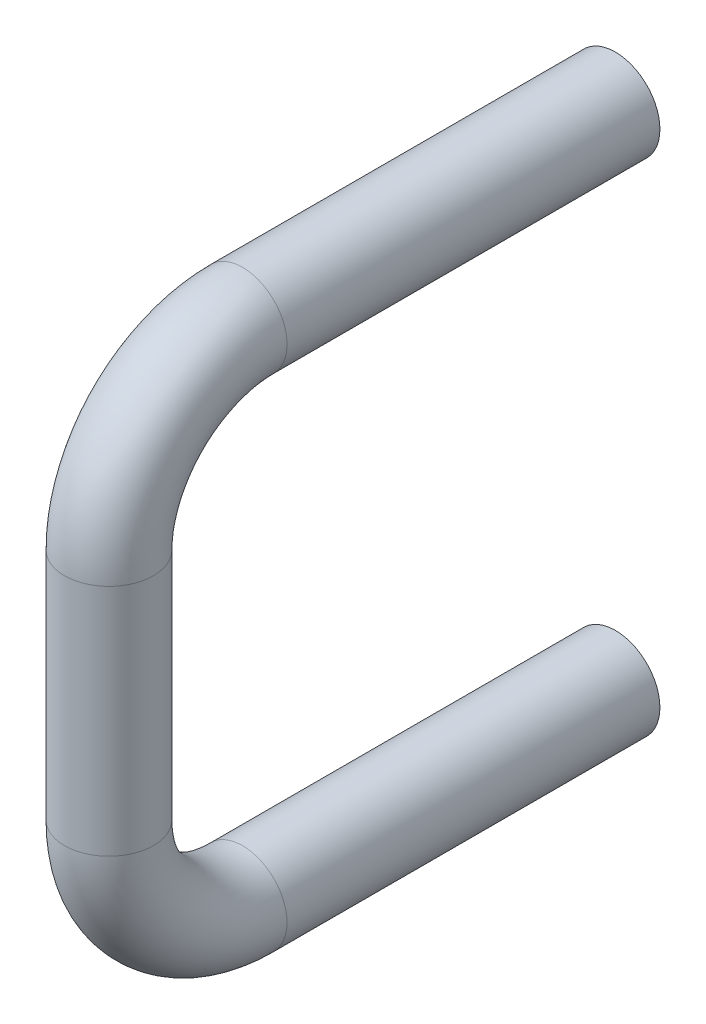
ISO-10303-21;
HEADER;
FILE_DESCRIPTION(('STEP AP214'),'2;1');
FILE_NAME('part.step','',(''),(''),'','','');
FILE_SCHEMA(('AUTOMOTIVE_DESIGN { 1 0 10303 214 1 1 1 1 }'));
ENDSEC;
DATA;
#1=APPLICATION_CONTEXT('core data for automotive mechanical design processes');
#2=APPLICATION_PROTOCOL_DEFINITION('international standard','automotive_design',2000,#1);
#3=PRODUCT_CONTEXT('',#1,'mechanical');
#4=PRODUCT('Part','Part','',(#3));
#5=PRODUCT_RELATED_PRODUCT_CATEGORY('part','',(#4));
#6=PRODUCT_DEFINITION_FORMATION('','',#4);
#7=PRODUCT_DEFINITION_CONTEXT('part definition',#1,'design');
#8=PRODUCT_DEFINITION('design','',#6,#7);
#9=PRODUCT_DEFINITION_SHAPE('','',#8);
#10=(LENGTH_UNIT() NAMED_UNIT(*) SI_UNIT(.MILLI.,.METRE.));
#11=(NAMED_UNIT(*) PLANE_ANGLE_UNIT() SI_UNIT($,.RADIAN.));
#12=(NAMED_UNIT(*) SI_UNIT($,.STERADIAN.) SOLID_ANGLE_UNIT());
#13=UNCERTAINTY_MEASURE_WITH_UNIT(LENGTH_MEASURE(1.E-05),#10,'distance_accuracy_value','');
#14=(GEOMETRIC_REPRESENTATION_CONTEXT(3) GLOBAL_UNCERTAINTY_ASSIGNED_CONTEXT((#13)) GLOBAL_UNIT_ASSIGNED_CONTEXT((#10,
#11,#12)) REPRESENTATION_CONTEXT('',''));
#15=CARTESIAN_POINT('',(0.,0.,0.));
#16=DIRECTION('',(0.,0.,1.));
#17=DIRECTION('',(1.,0.,0.));
#18=AXIS2_PLACEMENT_3D('',#15,#16,#17);
#19=CARTESIAN_POINT('',(240.,-45.,323.));
#20=DIRECTION('',(0.,0.,-1.));
#21=DIRECTION('',(1.,0.,0.));
#22=AXIS2_PLACEMENT_3D('',#19,#20,#21);
#23=PLANE('',#22);
#24=CARTESIAN_POINT('',(240.,-45.,323.));
#25=DIRECTION('',(0.,0.,-1.));
#26=DIRECTION('',(1.,0.,0.));
#27=AXIS2_PLACEMENT_3D('',#24,#25,#26);
#28=CIRCLE('',#27,8.00000000000001);
#29=CARTESIAN_POINT('',(248.,-45.,323.));
#30=VERTEX_POINT('',#29);
#31=EDGE_CURVE('E73',#30,#30,#28,.T.);
#32=ORIENTED_EDGE('',*,*,#31,.T.);
#33=EDGE_LOOP('',(#32));
#34=FACE_BOUND('',#33,.T.);
#35=ADVANCED_FACE('F51',(#34),#23,.T.);
#36=CARTESIAN_POINT('',(240.,45.,323.));
#37=DIRECTION('',(0.,0.,1.));
#38=DIRECTION('',(1.,0.,0.));
#39=AXIS2_PLACEMENT_3D('',#36,#37,#38);
#40=PLANE('',#39);
#41=CARTESIAN_POINT('',(240.,45.,323.));
#42=DIRECTION('',(0.,0.,1.));
#43=DIRECTION('',(1.,0.,0.));
#44=AXIS2_PLACEMENT_3D('',#41,#42,#43);
#45=CIRCLE('',#44,8.00000000000001);
#46=CARTESIAN_POINT('',(248.,45.,323.));
#47=VERTEX_POINT('',#46);
#48=EDGE_CURVE('E11',#47,#47,#45,.T.);
#49=ORIENTED_EDGE('',*,*,#48,.F.);
#50=EDGE_LOOP('',(#49));
#51=FACE_BOUND('',#50,.T.);
#52=ADVANCED_FACE('F83',(#51),#40,.F.);
#53=CARTESIAN_POINT('',(240.,-45.,323.));
#54=DIRECTION('',(0.,0.,1.));
#55=DIRECTION('',(1.,0.,0.));
#56=AXIS2_PLACEMENT_3D('',#53,#54,#55);
#57=CYLINDRICAL_SURFACE('',#56,8.00000000000001);
#58=CARTESIAN_POINT('',(240.,-45.,390.));
#59=DIRECTION('',(0.,0.,-1.));
#60=DIRECTION('',(1.,0.,0.));
#61=AXIS2_PLACEMENT_3D('',#58,#59,#60);
#62=CIRCLE('',#61,8.00000000000001);
#63=CARTESIAN_POINT('',(240.,-53.,390.));
#64=VERTEX_POINT('',#63);
#65=EDGE_CURVE('E68',#64,#64,#62,.T.);
#66=ORIENTED_EDGE('',*,*,#65,.T.);
#67=EDGE_LOOP('',(#66));
#68=FACE_BOUND('',#67,.T.);
#69=ORIENTED_EDGE('',*,*,#31,.F.);
#70=EDGE_LOOP('',(#69));
#71=FACE_BOUND('',#70,.T.);
#72=ADVANCED_FACE('F76',(#68,#71),#57,.T.);
#73=CARTESIAN_POINT('',(240.,-21.,390.));
#74=DIRECTION('',(-1.,0.,0.));
#75=DIRECTION('',(0.,0.,1.));
#76=AXIS2_PLACEMENT_3D('',#73,#74,#75);
#77=TOROIDAL_SURFACE('',#76,24.,8.00000000000001);
#78=CARTESIAN_POINT('',(240.,-21.,414.));
#79=DIRECTION('',(0.,-1.,0.));
#80=DIRECTION('',(1.,0.,0.));
#81=AXIS2_PLACEMENT_3D('',#78,#79,#80);
#82=CIRCLE('',#81,8.00000000000001);
#83=CARTESIAN_POINT('',(240.,-21.,422.));
#84=VERTEX_POINT('',#83);
#85=EDGE_CURVE('E61',#84,#84,#82,.T.);
#86=CARTESIAN_POINT('',(240.,-21.,390.));
#87=DIRECTION('',(-1.,0.,0.));
#88=DIRECTION('',(0.,0.,1.));
#89=AXIS2_PLACEMENT_3D('',#86,#87,#88);
#90=CIRCLE('',#89,32.);
#91=EDGE_CURVE('',#64,#84,#90,.T.);
#92=ORIENTED_EDGE('',*,*,#65,.F.);
#93=ORIENTED_EDGE('',*,*,#85,.T.);
#94=ORIENTED_EDGE('',*,*,#91,.T.);
#95=ORIENTED_EDGE('',*,*,#91,.F.);
#96=EDGE_LOOP('',(#92,#94,#93,#95));
#97=FACE_BOUND('',#96,.T.);
#98=ADVANCED_FACE('F79',(#97),#77,.T.);
#99=CARTESIAN_POINT('',(240.,-21.,414.));
#100=DIRECTION('',(0.,1.,0.));
#101=DIRECTION('',(0.,0.,1.));
#102=AXIS2_PLACEMENT_3D('',#99,#100,#101);
#103=CYLINDRICAL_SURFACE('',#102,8.00000000000001);
#104=CARTESIAN_POINT('',(240.,21.,414.));
#105=DIRECTION('',(0.,-1.,0.));
#106=DIRECTION('',(1.,0.,0.));
#107=AXIS2_PLACEMENT_3D('',#104,#105,#106);
#108=CIRCLE('',#107,8.00000000000001);
#109=CARTESIAN_POINT('',(240.,21.,422.));
#110=VERTEX_POINT('',#109);
#111=EDGE_CURVE('E62',#110,#110,#108,.T.);
#112=ORIENTED_EDGE('',*,*,#111,.T.);
#113=EDGE_LOOP('',(#112));
#114=FACE_BOUND('',#113,.T.);
#115=ORIENTED_EDGE('',*,*,#85,.F.);
#116=EDGE_LOOP('',(#115));
#117=FACE_BOUND('',#116,.T.);
#118=ADVANCED_FACE('F88',(#114,#117),#103,.T.);
#119=CARTESIAN_POINT('',(240.,21.,390.));
#120=DIRECTION('',(-1.,0.,0.));
#121=DIRECTION('',(0.,0.,1.));
#122=AXIS2_PLACEMENT_3D('',#119,#120,#121);
#123=TOROIDAL_SURFACE('',#122,24.,8.00000000000001);
#124=CARTESIAN_POINT('',(240.,45.0000000000008,390.));
#125=DIRECTION('',(0.,0.,1.));
#126=DIRECTION('',(1.,0.,0.));
#127=AXIS2_PLACEMENT_3D('',#124,#125,#126);
#128=CIRCLE('',#127,8.00000000000001);
#129=CARTESIAN_POINT('',(240.,53.,390.));
#130=VERTEX_POINT('',#129);
#131=EDGE_CURVE('E60',#130,#130,#128,.T.);
#132=CARTESIAN_POINT('',(240.,21.,390.));
#133=DIRECTION('',(-1.,0.,0.));
#134=DIRECTION('',(0.,0.,1.));
#135=AXIS2_PLACEMENT_3D('',#132,#133,#134);
#136=CIRCLE('',#135,32.);
#137=EDGE_CURVE('',#110,#130,#136,.T.);
#138=ORIENTED_EDGE('',*,*,#111,.F.);
#139=ORIENTED_EDGE('',*,*,#131,.T.);
#140=ORIENTED_EDGE('',*,*,#137,.T.);
#141=ORIENTED_EDGE('',*,*,#137,.F.);
#142=EDGE_LOOP('',(#138,#140,#139,#141));
#143=FACE_BOUND('',#142,.T.);
#144=ADVANCED_FACE('F92',(#143),#123,.T.);
#145=CARTESIAN_POINT('',(240.,45.,390.));
#146=DIRECTION('',(0.,0.,-1.));
#147=DIRECTION('',(-1.,0.,0.));
#148=AXIS2_PLACEMENT_3D('',#145,#146,#147);
#149=CYLINDRICAL_SURFACE('',#148,8.00000000000001);
#150=ORIENTED_EDGE('',*,*,#48,.T.);
#151=EDGE_LOOP('',(#150));
#152=FACE_BOUND('',#151,.T.);
#153=ORIENTED_EDGE('',*,*,#131,.F.);
#154=EDGE_LOOP('',(#153));
#155=FACE_BOUND('',#154,.T.);
#156=ADVANCED_FACE('F95',(#152,#155),#149,.T.);
#157=CLOSED_SHELL('',(#35,#52,#72,#98,#118,#144,#156));
#158=MANIFOLD_SOLID_BREP('B2',#157);
#159=ADVANCED_BREP_SHAPE_REPRESENTATION('',(#18,#158),#14);
#160=SHAPE_DEFINITION_REPRESENTATION(#9,#159);
ENDSEC;
END-ISO-10303-21;
